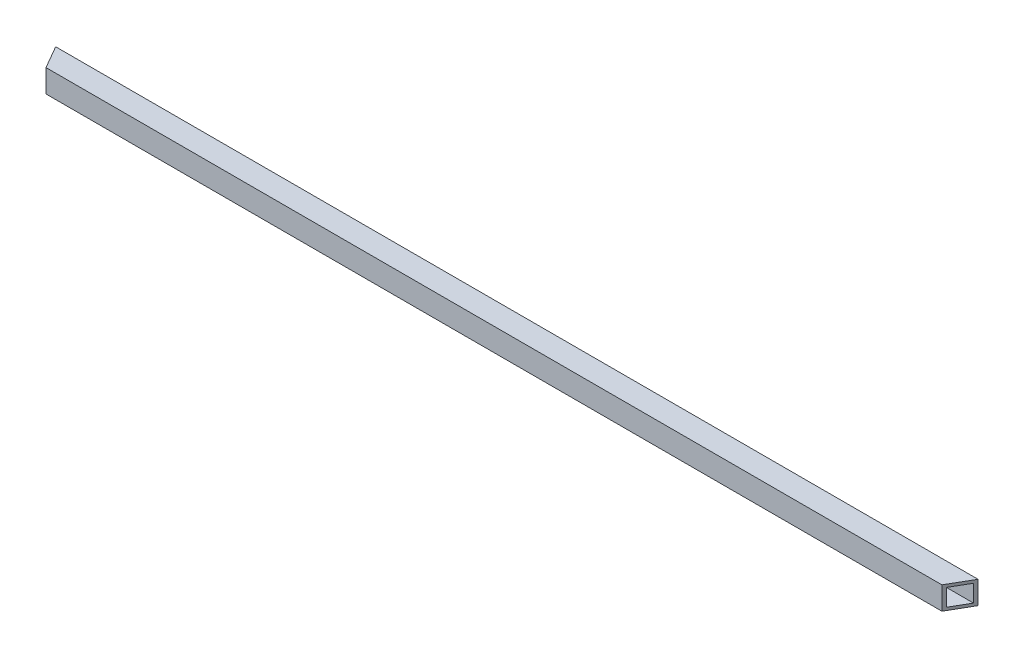
ISO-10303-21;
HEADER;
FILE_DESCRIPTION(('STEP AP214'),'2;1');
FILE_NAME('part.step','',(''),(''),'','','');
FILE_SCHEMA(('AUTOMOTIVE_DESIGN { 1 0 10303 214 1 1 1 1 }'));
ENDSEC;
DATA;
#1=APPLICATION_CONTEXT('core data for automotive mechanical design processes');
#2=APPLICATION_PROTOCOL_DEFINITION('international standard','automotive_design',2000,#1);
#3=PRODUCT_CONTEXT('',#1,'mechanical');
#4=PRODUCT('Part','Part','',(#3));
#5=PRODUCT_RELATED_PRODUCT_CATEGORY('part','',(#4));
#6=PRODUCT_DEFINITION_FORMATION('','',#4);
#7=PRODUCT_DEFINITION_CONTEXT('part definition',#1,'design');
#8=PRODUCT_DEFINITION('design','',#6,#7);
#9=PRODUCT_DEFINITION_SHAPE('','',#8);
#10=(LENGTH_UNIT() NAMED_UNIT(*) SI_UNIT(.MILLI.,.METRE.));
#11=(NAMED_UNIT(*) PLANE_ANGLE_UNIT() SI_UNIT($,.RADIAN.));
#12=(NAMED_UNIT(*) SI_UNIT($,.STERADIAN.) SOLID_ANGLE_UNIT());
#13=UNCERTAINTY_MEASURE_WITH_UNIT(LENGTH_MEASURE(1.E-05),#10,'distance_accuracy_value','');
#14=(GEOMETRIC_REPRESENTATION_CONTEXT(3) GLOBAL_UNCERTAINTY_ASSIGNED_CONTEXT((#13)) GLOBAL_UNIT_ASSIGNED_CONTEXT((#10,
#11,#12)) REPRESENTATION_CONTEXT('',''));
#15=CARTESIAN_POINT('',(0.,0.,0.));
#16=DIRECTION('',(0.,0.,1.));
#17=DIRECTION('',(1.,0.,0.));
#18=AXIS2_PLACEMENT_3D('',#15,#16,#17);
#19=CARTESIAN_POINT('',(-994.89262813177,0.,63.5));
#20=DIRECTION('',(0.,0.,1.));
#21=DIRECTION('',(1.,0.,0.));
#22=AXIS2_PLACEMENT_3D('',#19,#20,#21);
#23=PLANE('',#22);
#24=DIRECTION('',(1.,0.,0.));
#25=VECTOR('',#24,1.);
#26=CARTESIAN_POINT('',(0.,50.8,63.5));
#27=LINE('',#26,#25);
#28=CARTESIAN_POINT('',(-994.892628131777,50.8,63.5000000000038));
#29=VERTEX_POINT('',#28);
#30=CARTESIAN_POINT('',(994.89262813177,50.8,63.5));
#31=VERTEX_POINT('',#30);
#32=EDGE_CURVE('E137',#29,#31,#27,.T.);
#33=ORIENTED_EDGE('',*,*,#32,.F.);
#34=DIRECTION('',(0.,1.,0.));
#35=VECTOR('',#34,1.);
#36=CARTESIAN_POINT('',(-994.892628131783,0.,63.5000000000077));
#37=LINE('',#36,#35);
#38=CARTESIAN_POINT('',(-994.892628131773,0.,63.5000000000019));
#39=VERTEX_POINT('',#38);
#40=EDGE_CURVE('E104',#39,#29,#37,.T.);
#41=ORIENTED_EDGE('',*,*,#40,.F.);
#42=DIRECTION('',(1.,0.,0.));
#43=VECTOR('',#42,1.);
#44=CARTESIAN_POINT('',(0.,0.,63.5));
#45=LINE('',#44,#43);
#46=CARTESIAN_POINT('',(994.89262813177,0.,63.5));
#47=VERTEX_POINT('',#46);
#48=EDGE_CURVE('E88',#39,#47,#45,.T.);
#49=ORIENTED_EDGE('',*,*,#48,.T.);
#50=DIRECTION('',(0.,1.,0.));
#51=VECTOR('',#50,1.);
#52=CARTESIAN_POINT('',(994.89262813177,0.,63.5));
#53=LINE('',#52,#51);
#54=EDGE_CURVE('E127',#31,#47,#53,.F.);
#55=ORIENTED_EDGE('',*,*,#54,.F.);
#56=EDGE_LOOP('',(#33,#41,#49,#55));
#57=FACE_BOUND('',#56,.T.);
#58=ADVANCED_FACE('F16',(#57),#23,.T.);
#59=CARTESIAN_POINT('',(0.,6.35,0.));
#60=DIRECTION('',(0.,1.,0.));
#61=DIRECTION('',(0.,0.,1.));
#62=AXIS2_PLACEMENT_3D('',#59,#60,#61);
#63=PLANE('',#62);
#64=DIRECTION('',(0.500000000000017,0.,-0.866025403784429));
#65=VECTOR('',#64,1.);
#66=CARTESIAN_POINT('',(994.89262813177,6.35,63.5));
#67=LINE('',#66,#65);
#68=CARTESIAN_POINT('',(1020.55584759721,6.35,19.0500000000104));
#69=VERTEX_POINT('',#68);
#70=CARTESIAN_POINT('',(998.558802341178,6.35,57.1499999999929));
#71=VERTEX_POINT('',#70);
#72=EDGE_CURVE('E84',#69,#71,#67,.F.);
#73=ORIENTED_EDGE('',*,*,#72,.F.);
#74=DIRECTION('',(-1.,0.,0.));
#75=VECTOR('',#74,1.);
#76=CARTESIAN_POINT('',(1024.22202180662,6.35,19.05));
#77=LINE('',#76,#75);
#78=CARTESIAN_POINT('',(-1020.55584759721,6.35,19.0500000000128));
#79=VERTEX_POINT('',#78);
#80=EDGE_CURVE('E77',#69,#79,#77,.T.);
#81=ORIENTED_EDGE('',*,*,#80,.T.);
#82=DIRECTION('',(0.500000000000017,0.,0.866025403784429));
#83=VECTOR('',#82,1.);
#84=CARTESIAN_POINT('',(-1024.22202180662,6.35,12.7));
#85=LINE('',#84,#83);
#86=CARTESIAN_POINT('',(-998.558802341181,6.35,57.1499999999948));
#87=VERTEX_POINT('',#86);
#88=EDGE_CURVE('E81',#87,#79,#85,.F.);
#89=ORIENTED_EDGE('',*,*,#88,.F.);
#90=DIRECTION('',(1.,0.,0.));
#91=VECTOR('',#90,1.);
#92=CARTESIAN_POINT('',(-994.89262813177,6.35,57.15));
#93=LINE('',#92,#91);
#94=EDGE_CURVE('E19',#87,#71,#93,.T.);
#95=ORIENTED_EDGE('',*,*,#94,.T.);
#96=EDGE_LOOP('',(#73,#81,#89,#95));
#97=FACE_BOUND('',#96,.T.);
#98=ADVANCED_FACE('F79',(#97),#63,.T.);
#99=CARTESIAN_POINT('',(-994.89262813177,0.,57.15));
#100=DIRECTION('',(0.,0.,1.));
#101=DIRECTION('',(1.,0.,0.));
#102=AXIS2_PLACEMENT_3D('',#99,#100,#101);
#103=PLANE('',#102);
#104=DIRECTION('',(1.,0.,0.));
#105=VECTOR('',#104,1.);
#106=CARTESIAN_POINT('',(0.,44.45,57.15));
#107=LINE('',#106,#105);
#108=CARTESIAN_POINT('',(-998.558802341181,44.45,57.1499999999948));
#109=VERTEX_POINT('',#108);
#110=CARTESIAN_POINT('',(998.558802341178,44.45,57.1499999999929));
#111=VERTEX_POINT('',#110);
#112=EDGE_CURVE('E113',#109,#111,#107,.T.);
#113=ORIENTED_EDGE('',*,*,#112,.T.);
#114=DIRECTION('',(0.,1.,0.));
#115=VECTOR('',#114,1.);
#116=CARTESIAN_POINT('',(998.558802341141,0.,57.1499999999716));
#117=LINE('',#116,#115);
#118=EDGE_CURVE('E118',#71,#111,#117,.T.);
#119=ORIENTED_EDGE('',*,*,#118,.F.);
#120=ORIENTED_EDGE('',*,*,#94,.F.);
#121=DIRECTION('',(0.,1.,0.));
#122=VECTOR('',#121,1.);
#123=CARTESIAN_POINT('',(-998.558802341154,0.,57.1499999999792));
#124=LINE('',#123,#122);
#125=EDGE_CURVE('E103',#109,#87,#124,.F.);
#126=ORIENTED_EDGE('',*,*,#125,.F.);
#127=EDGE_LOOP('',(#113,#119,#120,#126));
#128=FACE_BOUND('',#127,.T.);
#129=ADVANCED_FACE('F119',(#128),#103,.F.);
#130=CARTESIAN_POINT('',(0.,44.45,0.));
#131=DIRECTION('',(0.,1.,0.));
#132=DIRECTION('',(0.,0.,1.));
#133=AXIS2_PLACEMENT_3D('',#130,#131,#132);
#134=PLANE('',#133);
#135=DIRECTION('',(-1.,0.,0.));
#136=VECTOR('',#135,1.);
#137=CARTESIAN_POINT('',(1024.22202180662,44.45,19.05));
#138=LINE('',#137,#136);
#139=CARTESIAN_POINT('',(-1020.55584759721,44.45,19.0500000000109));
#140=VERTEX_POINT('',#139);
#141=CARTESIAN_POINT('',(1020.55584759721,44.45,19.0500000000104));
#142=VERTEX_POINT('',#141);
#143=EDGE_CURVE('E89',#140,#142,#138,.F.);
#144=ORIENTED_EDGE('',*,*,#143,.T.);
#145=DIRECTION('',(0.500000000000017,0.,-0.866025403784429));
#146=VECTOR('',#145,1.);
#147=CARTESIAN_POINT('',(994.89262813177,44.45,63.5));
#148=LINE('',#147,#146);
#149=EDGE_CURVE('E122',#111,#142,#148,.T.);
#150=ORIENTED_EDGE('',*,*,#149,.F.);
#151=ORIENTED_EDGE('',*,*,#112,.F.);
#152=DIRECTION('',(0.500000000000017,0.,0.866025403784429));
#153=VECTOR('',#152,1.);
#154=CARTESIAN_POINT('',(-1024.22202180662,44.45,12.7));
#155=LINE('',#154,#153);
#156=EDGE_CURVE('E97',#140,#109,#155,.T.);
#157=ORIENTED_EDGE('',*,*,#156,.F.);
#158=EDGE_LOOP('',(#144,#150,#151,#157));
#159=FACE_BOUND('',#158,.T.);
#160=ADVANCED_FACE('F143',(#159),#134,.F.);
#161=CARTESIAN_POINT('',(1024.22202180662,0.,19.05));
#162=DIRECTION('',(0.,0.,-1.));
#163=DIRECTION('',(-1.,0.,0.));
#164=AXIS2_PLACEMENT_3D('',#161,#162,#163);
#165=PLANE('',#164);
#166=ORIENTED_EDGE('',*,*,#80,.F.);
#167=DIRECTION('',(0.,1.,0.));
#168=VECTOR('',#167,1.);
#169=CARTESIAN_POINT('',(1020.55584759723,0.,19.0500000000265));
#170=LINE('',#169,#168);
#171=EDGE_CURVE('E126',#142,#69,#170,.F.);
#172=ORIENTED_EDGE('',*,*,#171,.F.);
#173=ORIENTED_EDGE('',*,*,#143,.F.);
#174=DIRECTION('',(0.,1.,0.));
#175=VECTOR('',#174,1.);
#176=CARTESIAN_POINT('',(-1020.55584759725,0.,19.0500000000361));
#177=LINE('',#176,#175);
#178=EDGE_CURVE('E92',#79,#140,#177,.T.);
#179=ORIENTED_EDGE('',*,*,#178,.F.);
#180=EDGE_LOOP('',(#166,#172,#173,#179));
#181=FACE_BOUND('',#180,.T.);
#182=ADVANCED_FACE('F93',(#181),#165,.F.);
#183=CARTESIAN_POINT('',(0.,0.,0.));
#184=DIRECTION('',(0.,1.,0.));
#185=DIRECTION('',(0.,0.,1.));
#186=AXIS2_PLACEMENT_3D('',#183,#184,#185);
#187=PLANE('',#186);
#188=DIRECTION('',(-1.,0.,0.));
#189=VECTOR('',#188,1.);
#190=CARTESIAN_POINT('',(1024.22202180662,0.,12.7));
#191=LINE('',#190,#189);
#192=CARTESIAN_POINT('',(1024.22202180662,0.,12.6999999999963));
#193=VERTEX_POINT('',#192);
#194=CARTESIAN_POINT('',(-1024.22202180662,0.,12.6999999999987));
#195=VERTEX_POINT('',#194);
#196=EDGE_CURVE('E144',#193,#195,#191,.T.);
#197=ORIENTED_EDGE('',*,*,#196,.F.);
#198=DIRECTION('',(0.500000000000017,0.,-0.866025403784429));
#199=VECTOR('',#198,1.);
#200=CARTESIAN_POINT('',(994.89262813177,0.,63.5));
#201=LINE('',#200,#199);
#202=EDGE_CURVE('E134',#47,#193,#201,.T.);
#203=ORIENTED_EDGE('',*,*,#202,.F.);
#204=ORIENTED_EDGE('',*,*,#48,.F.);
#205=DIRECTION('',(0.500000000000017,0.,0.866025403784429));
#206=VECTOR('',#205,1.);
#207=CARTESIAN_POINT('',(-1024.22202180662,0.,12.7));
#208=LINE('',#207,#206);
#209=EDGE_CURVE('E106',#195,#39,#208,.T.);
#210=ORIENTED_EDGE('',*,*,#209,.F.);
#211=EDGE_LOOP('',(#197,#203,#204,#210));
#212=FACE_BOUND('',#211,.T.);
#213=ADVANCED_FACE('F164',(#212),#187,.F.);
#214=CARTESIAN_POINT('',(-1024.22202180662,0.,12.7));
#215=DIRECTION('',(-0.866025403784429,0.,0.500000000000017));
#216=DIRECTION('',(0.500000000000017,0.,0.866025403784429));
#217=AXIS2_PLACEMENT_3D('',#214,#215,#216);
#218=PLANE('',#217);
#219=ORIENTED_EDGE('',*,*,#156,.T.);
#220=ORIENTED_EDGE('',*,*,#125,.T.);
#221=ORIENTED_EDGE('',*,*,#88,.T.);
#222=ORIENTED_EDGE('',*,*,#178,.T.);
#223=EDGE_LOOP('',(#219,#220,#221,#222));
#224=FACE_BOUND('',#223,.T.);
#225=DIRECTION('',(0.500000000000243,0.,0.866025403784298));
#226=VECTOR('',#225,1.);
#227=CARTESIAN_POINT('',(-1024.22202180662,50.8,12.7));
#228=LINE('',#227,#226);
#229=CARTESIAN_POINT('',(-1024.22202180662,50.8,12.6999999999994));
#230=VERTEX_POINT('',#229);
#231=EDGE_CURVE('E139',#230,#29,#228,.T.);
#232=ORIENTED_EDGE('',*,*,#231,.F.);
#233=DIRECTION('',(0.,1.,0.));
#234=VECTOR('',#233,1.);
#235=CARTESIAN_POINT('',(-1024.22202180662,0.,12.7));
#236=LINE('',#235,#234);
#237=EDGE_CURVE('E149',#195,#230,#236,.T.);
#238=ORIENTED_EDGE('',*,*,#237,.F.);
#239=ORIENTED_EDGE('',*,*,#209,.T.);
#240=ORIENTED_EDGE('',*,*,#40,.T.);
#241=EDGE_LOOP('',(#232,#238,#239,#240));
#242=FACE_BOUND('',#241,.T.);
#243=ADVANCED_FACE('F100',(#224,#242),#218,.T.);
#244=CARTESIAN_POINT('',(0.,50.8,0.));
#245=DIRECTION('',(0.,1.,0.));
#246=DIRECTION('',(0.,0.,1.));
#247=AXIS2_PLACEMENT_3D('',#244,#245,#246);
#248=PLANE('',#247);
#249=DIRECTION('',(0.500000000000017,0.,-0.866025403784429));
#250=VECTOR('',#249,1.);
#251=CARTESIAN_POINT('',(994.89262813177,50.8,63.5));
#252=LINE('',#251,#250);
#253=CARTESIAN_POINT('',(1024.22202180662,50.8,12.6999999999963));
#254=VERTEX_POINT('',#253);
#255=EDGE_CURVE('E34',#254,#31,#252,.F.);
#256=ORIENTED_EDGE('',*,*,#255,.F.);
#257=DIRECTION('',(-1.,0.,0.));
#258=VECTOR('',#257,1.);
#259=CARTESIAN_POINT('',(1024.22202180662,50.8,12.7));
#260=LINE('',#259,#258);
#261=EDGE_CURVE('E25',#230,#254,#260,.F.);
#262=ORIENTED_EDGE('',*,*,#261,.F.);
#263=ORIENTED_EDGE('',*,*,#231,.T.);
#264=ORIENTED_EDGE('',*,*,#32,.T.);
#265=EDGE_LOOP('',(#256,#262,#263,#264));
#266=FACE_BOUND('',#265,.T.);
#267=ADVANCED_FACE('F156',(#266),#248,.T.);
#268=CARTESIAN_POINT('',(994.89262813177,0.,63.5));
#269=DIRECTION('',(0.866025403784429,0.,0.500000000000017));
#270=DIRECTION('',(0.500000000000017,0.,-0.866025403784429));
#271=AXIS2_PLACEMENT_3D('',#268,#269,#270);
#272=PLANE('',#271);
#273=ORIENTED_EDGE('',*,*,#149,.T.);
#274=ORIENTED_EDGE('',*,*,#171,.T.);
#275=ORIENTED_EDGE('',*,*,#72,.T.);
#276=ORIENTED_EDGE('',*,*,#118,.T.);
#277=EDGE_LOOP('',(#273,#274,#275,#276));
#278=FACE_BOUND('',#277,.T.);
#279=ORIENTED_EDGE('',*,*,#255,.T.);
#280=ORIENTED_EDGE('',*,*,#54,.T.);
#281=ORIENTED_EDGE('',*,*,#202,.T.);
#282=DIRECTION('',(0.,1.,0.));
#283=VECTOR('',#282,1.);
#284=CARTESIAN_POINT('',(1024.22202180662,0.,12.7));
#285=LINE('',#284,#283);
#286=EDGE_CURVE('E11',#254,#193,#285,.F.);
#287=ORIENTED_EDGE('',*,*,#286,.F.);
#288=EDGE_LOOP('',(#279,#280,#281,#287));
#289=FACE_BOUND('',#288,.T.);
#290=ADVANCED_FACE('F124',(#278,#289),#272,.T.);
#291=CARTESIAN_POINT('',(1024.22202180662,0.,12.7));
#292=DIRECTION('',(0.,0.,-1.));
#293=DIRECTION('',(-1.,0.,0.));
#294=AXIS2_PLACEMENT_3D('',#291,#292,#293);
#295=PLANE('',#294);
#296=ORIENTED_EDGE('',*,*,#261,.T.);
#297=ORIENTED_EDGE('',*,*,#286,.T.);
#298=ORIENTED_EDGE('',*,*,#196,.T.);
#299=ORIENTED_EDGE('',*,*,#237,.T.);
#300=EDGE_LOOP('',(#296,#297,#298,#299));
#301=FACE_BOUND('',#300,.T.);
#302=ADVANCED_FACE('F154',(#301),#295,.T.);
#303=CLOSED_SHELL('',(#58,#98,#129,#160,#182,#213,#243,#267,#290,#302));
#304=MANIFOLD_SOLID_BREP('B1',#303);
#305=ADVANCED_BREP_SHAPE_REPRESENTATION('',(#18,#304),#14);
#306=SHAPE_DEFINITION_REPRESENTATION(#9,#305);
ENDSEC;
END-ISO-10303-21;
